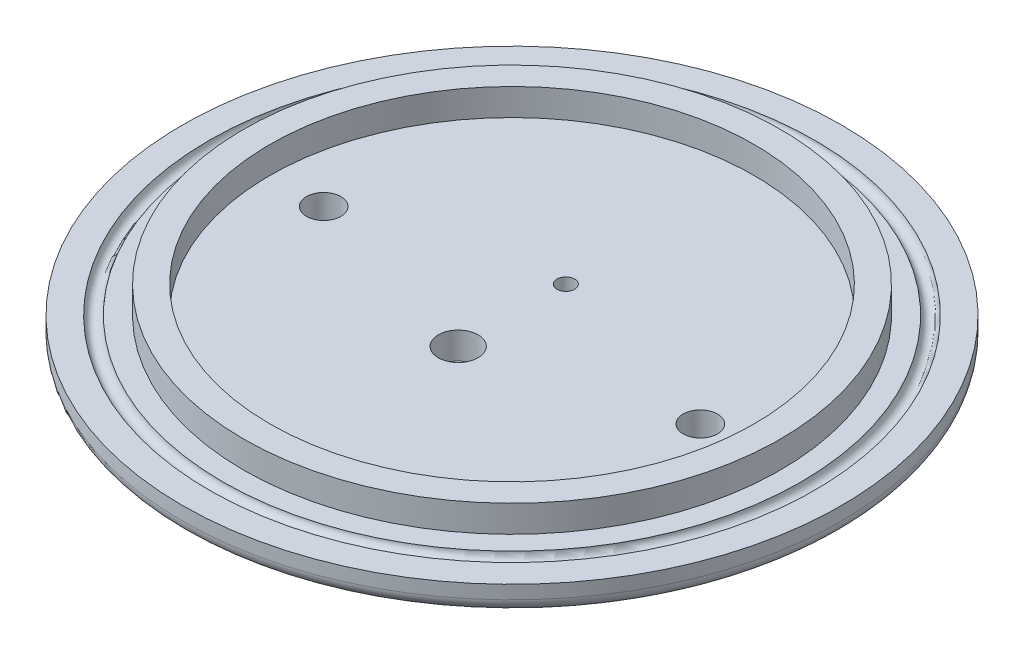
ISO-10303-21;
HEADER;
FILE_DESCRIPTION(('STEP AP214'),'2;1');
FILE_NAME('part.step','',(''),(''),'','','');
FILE_SCHEMA(('AUTOMOTIVE_DESIGN { 1 0 10303 214 1 1 1 1 }'));
ENDSEC;
DATA;
#1=APPLICATION_CONTEXT('core data for automotive mechanical design processes');
#2=APPLICATION_PROTOCOL_DEFINITION('international standard','automotive_design',2000,#1);
#3=PRODUCT_CONTEXT('',#1,'mechanical');
#4=PRODUCT('Part','Part','',(#3));
#5=PRODUCT_RELATED_PRODUCT_CATEGORY('part','',(#4));
#6=PRODUCT_DEFINITION_FORMATION('','',#4);
#7=PRODUCT_DEFINITION_CONTEXT('part definition',#1,'design');
#8=PRODUCT_DEFINITION('design','',#6,#7);
#9=PRODUCT_DEFINITION_SHAPE('','',#8);
#10=(LENGTH_UNIT() NAMED_UNIT(*) SI_UNIT(.MILLI.,.METRE.));
#11=(NAMED_UNIT(*) PLANE_ANGLE_UNIT() SI_UNIT($,.RADIAN.));
#12=(NAMED_UNIT(*) SI_UNIT($,.STERADIAN.) SOLID_ANGLE_UNIT());
#13=UNCERTAINTY_MEASURE_WITH_UNIT(LENGTH_MEASURE(1.E-05),#10,'distance_accuracy_value','');
#14=(GEOMETRIC_REPRESENTATION_CONTEXT(3) GLOBAL_UNCERTAINTY_ASSIGNED_CONTEXT((#13)) GLOBAL_UNIT_ASSIGNED_CONTEXT((#10,
#11,#12)) REPRESENTATION_CONTEXT('',''));
#15=CARTESIAN_POINT('',(0.,0.,0.));
#16=DIRECTION('',(0.,0.,1.));
#17=DIRECTION('',(1.,0.,0.));
#18=AXIS2_PLACEMENT_3D('',#15,#16,#17);
#19=CARTESIAN_POINT('',(0.,10.,0.));
#20=DIRECTION('',(0.,1.,0.));
#21=DIRECTION('',(0.,0.,1.));
#22=AXIS2_PLACEMENT_3D('',#19,#20,#21);
#23=PLANE('',#22);
#24=CARTESIAN_POINT('',(0.,10.,0.));
#25=DIRECTION('',(0.,1.,0.));
#26=DIRECTION('',(0.,0.,1.));
#27=AXIS2_PLACEMENT_3D('',#24,#25,#26);
#28=CIRCLE('',#27,122.5);
#29=CARTESIAN_POINT('',(0.,10.,122.5));
#30=VERTEX_POINT('',#29);
#31=EDGE_CURVE('E1578',#30,#30,#28,.T.);
#32=ORIENTED_EDGE('',*,*,#31,.T.);
#33=EDGE_LOOP('',(#32));
#34=FACE_BOUND('',#33,.T.);
#35=CARTESIAN_POINT('',(0.,10.,0.));
#36=DIRECTION('',(0.,1.,0.));
#37=DIRECTION('',(0.,0.,1.));
#38=AXIS2_PLACEMENT_3D('',#35,#36,#37);
#39=CIRCLE('',#38,112.6);
#40=CARTESIAN_POINT('',(-112.6,10.,0.));
#41=VERTEX_POINT('',#40);
#42=EDGE_CURVE('E1579',#41,#41,#39,.T.);
#43=ORIENTED_EDGE('',*,*,#42,.F.);
#44=EDGE_LOOP('',(#43));
#45=FACE_BOUND('',#44,.T.);
#46=ADVANCED_FACE('F1553',(#34,#45),#23,.T.);
#47=CARTESIAN_POINT('',(0.,10.,0.));
#48=DIRECTION('',(0.,-1.,0.));
#49=DIRECTION('',(0.,0.,-1.));
#50=AXIS2_PLACEMENT_3D('',#47,#48,#49);
#51=CYLINDRICAL_SURFACE('',#50,122.5);
#52=CARTESIAN_POINT('',(0.,5.,0.));
#53=DIRECTION('',(0.,1.,0.));
#54=DIRECTION('',(0.,0.,1.));
#55=AXIS2_PLACEMENT_3D('',#52,#53,#54);
#56=CIRCLE('',#55,122.5);
#57=CARTESIAN_POINT('',(0.,5.,122.5));
#58=VERTEX_POINT('',#57);
#59=EDGE_CURVE('E1563',#58,#58,#56,.T.);
#60=ORIENTED_EDGE('',*,*,#59,.T.);
#61=EDGE_LOOP('',(#60));
#62=FACE_BOUND('',#61,.T.);
#63=ORIENTED_EDGE('',*,*,#31,.F.);
#64=EDGE_LOOP('',(#63));
#65=FACE_BOUND('',#64,.T.);
#66=ADVANCED_FACE('F1651',(#62,#65),#51,.T.);
#67=CARTESIAN_POINT('',(0.,0.,0.));
#68=DIRECTION('',(0.,1.,0.));
#69=DIRECTION('',(0.,0.,1.));
#70=AXIS2_PLACEMENT_3D('',#67,#68,#69);
#71=PLANE('',#70);
#72=CARTESIAN_POINT('',(-70.,0.,0.));
#73=DIRECTION('',(0.,-1.,0.));
#74=DIRECTION('',(0.,0.,-1.));
#75=AXIS2_PLACEMENT_3D('',#72,#73,#74);
#76=CIRCLE('',#75,6.40000000000001);
#77=CARTESIAN_POINT('',(-70.,0.,-6.40000000000002));
#78=VERTEX_POINT('',#77);
#79=EDGE_CURVE('E1607',#78,#78,#76,.T.);
#80=ORIENTED_EDGE('',*,*,#79,.F.);
#81=EDGE_LOOP('',(#80));
#82=FACE_BOUND('',#81,.T.);
#83=CARTESIAN_POINT('',(0.,0.,20.));
#84=DIRECTION('',(0.,-1.,0.));
#85=DIRECTION('',(0.,0.,-1.));
#86=AXIS2_PLACEMENT_3D('',#83,#84,#85);
#87=CIRCLE('',#86,7.4);
#88=CARTESIAN_POINT('',(0.,0.,12.6));
#89=VERTEX_POINT('',#88);
#90=EDGE_CURVE('E1642',#89,#89,#87,.T.);
#91=ORIENTED_EDGE('',*,*,#90,.F.);
#92=EDGE_LOOP('',(#91));
#93=FACE_BOUND('',#92,.T.);
#94=CARTESIAN_POINT('',(0.,0.,-20.));
#95=DIRECTION('',(0.,-1.,0.));
#96=DIRECTION('',(0.,0.,-1.));
#97=AXIS2_PLACEMENT_3D('',#94,#95,#96);
#98=CIRCLE('',#97,3.3);
#99=CARTESIAN_POINT('',(0.,0.,-23.3));
#100=VERTEX_POINT('',#99);
#101=EDGE_CURVE('E1640',#100,#100,#98,.T.);
#102=ORIENTED_EDGE('',*,*,#101,.F.);
#103=EDGE_LOOP('',(#102));
#104=FACE_BOUND('',#103,.T.);
#105=CARTESIAN_POINT('',(70.,0.,0.));
#106=DIRECTION('',(0.,-1.,0.));
#107=DIRECTION('',(0.,0.,-1.));
#108=AXIS2_PLACEMENT_3D('',#105,#106,#107);
#109=CIRCLE('',#108,6.40000000000001);
#110=CARTESIAN_POINT('',(70.,0.,-6.40000000000001));
#111=VERTEX_POINT('',#110);
#112=EDGE_CURVE('E1633',#111,#111,#109,.T.);
#113=ORIENTED_EDGE('',*,*,#112,.F.);
#114=EDGE_LOOP('',(#113));
#115=FACE_BOUND('',#114,.T.);
#116=CARTESIAN_POINT('',(0.,0.,0.));
#117=DIRECTION('',(0.,1.,0.));
#118=DIRECTION('',(0.,0.,1.));
#119=AXIS2_PLACEMENT_3D('',#116,#117,#118);
#120=CIRCLE('',#119,117.5);
#121=CARTESIAN_POINT('',(0.,0.,117.5));
#122=VERTEX_POINT('',#121);
#123=EDGE_CURVE('E12',#122,#122,#120,.F.);
#124=ORIENTED_EDGE('',*,*,#123,.T.);
#125=EDGE_LOOP('',(#124));
#126=FACE_BOUND('',#125,.T.);
#127=ADVANCED_FACE('F1655',(#82,#93,#104,#115,#126),#71,.F.);
#128=CARTESIAN_POINT('',(0.,10.,0.));
#129=DIRECTION('',(0.,1.,0.));
#130=DIRECTION('',(0.,0.,1.));
#131=AXIS2_PLACEMENT_3D('',#128,#129,#130);
#132=TOROIDAL_SURFACE('',#131,110.,2.6);
#133=ORIENTED_EDGE('',*,*,#42,.T.);
#134=CARTESIAN_POINT('',(-110.,10.,0.));
#135=DIRECTION('',(0.,0.,1.));
#136=DIRECTION('',(1.,0.,0.));
#137=AXIS2_PLACEMENT_3D('',#134,#135,#136);
#138=CIRCLE('',#137,2.6);
#139=CARTESIAN_POINT('',(-107.4,10.,0.));
#140=VERTEX_POINT('',#139);
#141=EDGE_CURVE('E1571',#41,#140,#138,.T.);
#142=ORIENTED_EDGE('',*,*,#141,.T.);
#143=CARTESIAN_POINT('',(0.,10.,0.));
#144=DIRECTION('',(0.,-1.,0.));
#145=DIRECTION('',(0.,0.,-1.));
#146=AXIS2_PLACEMENT_3D('',#143,#144,#145);
#147=CIRCLE('',#146,107.4);
#148=EDGE_CURVE('E1577',#140,#140,#147,.T.);
#149=ORIENTED_EDGE('',*,*,#148,.T.);
#150=ORIENTED_EDGE('',*,*,#141,.F.);
#151=EDGE_LOOP('',(#133,#142,#149,#150));
#152=FACE_BOUND('',#151,.T.);
#153=ADVANCED_FACE('F1574',(#152),#132,.F.);
#154=CARTESIAN_POINT('',(0.,10.,0.));
#155=DIRECTION('',(0.,1.,0.));
#156=DIRECTION('',(0.,0.,1.));
#157=AXIS2_PLACEMENT_3D('',#154,#155,#156);
#158=CIRCLE('',#157,99.75);
#159=CARTESIAN_POINT('',(0.,10.,99.75));
#160=VERTEX_POINT('',#159);
#161=EDGE_CURVE('E1589',#160,#160,#158,.T.);
#162=ORIENTED_EDGE('',*,*,#161,.F.);
#163=EDGE_LOOP('',(#162));
#164=FACE_BOUND('',#163,.T.);
#165=ORIENTED_EDGE('',*,*,#148,.F.);
#166=EDGE_LOOP('',(#165));
#167=FACE_BOUND('',#166,.T.);
#168=ADVANCED_FACE('F1677',(#164,#167),#23,.T.);
#169=CARTESIAN_POINT('',(0.,20.,0.));
#170=DIRECTION('',(0.,1.,0.));
#171=DIRECTION('',(0.,0.,1.));
#172=AXIS2_PLACEMENT_3D('',#169,#170,#171);
#173=PLANE('',#172);
#174=CARTESIAN_POINT('',(0.,20.,0.));
#175=DIRECTION('',(0.,1.,0.));
#176=DIRECTION('',(0.,0.,1.));
#177=AXIS2_PLACEMENT_3D('',#174,#175,#176);
#178=CIRCLE('',#177,99.75);
#179=CARTESIAN_POINT('',(0.,20.,99.75));
#180=VERTEX_POINT('',#179);
#181=EDGE_CURVE('E1582',#180,#180,#178,.T.);
#182=ORIENTED_EDGE('',*,*,#181,.T.);
#183=EDGE_LOOP('',(#182));
#184=FACE_BOUND('',#183,.T.);
#185=CARTESIAN_POINT('',(0.,20.,0.));
#186=DIRECTION('',(0.,1.,0.));
#187=DIRECTION('',(0.,0.,1.));
#188=AXIS2_PLACEMENT_3D('',#185,#186,#187);
#189=CIRCLE('',#188,90.);
#190=CARTESIAN_POINT('',(0.,20.,90.));
#191=VERTEX_POINT('',#190);
#192=EDGE_CURVE('E1618',#191,#191,#189,.T.);
#193=ORIENTED_EDGE('',*,*,#192,.F.);
#194=EDGE_LOOP('',(#193));
#195=FACE_BOUND('',#194,.T.);
#196=ADVANCED_FACE('F1690',(#184,#195),#173,.T.);
#197=CARTESIAN_POINT('',(0.,20.,0.));
#198=DIRECTION('',(0.,-1.,0.));
#199=DIRECTION('',(0.,0.,-1.));
#200=AXIS2_PLACEMENT_3D('',#197,#198,#199);
#201=CYLINDRICAL_SURFACE('',#200,99.75);
#202=ORIENTED_EDGE('',*,*,#181,.F.);
#203=EDGE_LOOP('',(#202));
#204=FACE_BOUND('',#203,.T.);
#205=ORIENTED_EDGE('',*,*,#161,.T.);
#206=EDGE_LOOP('',(#205));
#207=FACE_BOUND('',#206,.T.);
#208=ADVANCED_FACE('F1694',(#204,#207),#201,.T.);
#209=CARTESIAN_POINT('',(0.,20.,0.));
#210=DIRECTION('',(0.,-1.,0.));
#211=DIRECTION('',(0.,0.,-1.));
#212=AXIS2_PLACEMENT_3D('',#209,#210,#211);
#213=CYLINDRICAL_SURFACE('',#212,90.);
#214=ORIENTED_EDGE('',*,*,#192,.T.);
#215=EDGE_LOOP('',(#214));
#216=FACE_BOUND('',#215,.T.);
#217=CARTESIAN_POINT('',(0.,10.,0.));
#218=DIRECTION('',(0.,1.,0.));
#219=DIRECTION('',(0.,0.,1.));
#220=AXIS2_PLACEMENT_3D('',#217,#218,#219);
#221=CIRCLE('',#220,90.);
#222=CARTESIAN_POINT('',(0.,10.,90.));
#223=VERTEX_POINT('',#222);
#224=EDGE_CURVE('E1600',#223,#223,#221,.F.);
#225=ORIENTED_EDGE('',*,*,#224,.T.);
#226=EDGE_LOOP('',(#225));
#227=FACE_BOUND('',#226,.T.);
#228=ADVANCED_FACE('F1681',(#216,#227),#213,.F.);
#229=CARTESIAN_POINT('',(-70.,10.,0.));
#230=DIRECTION('',(0.,1.,0.));
#231=DIRECTION('',(0.,0.,1.));
#232=AXIS2_PLACEMENT_3D('',#229,#230,#231);
#233=CIRCLE('',#232,6.40000000000001);
#234=CARTESIAN_POINT('',(-70.,10.,6.4));
#235=VERTEX_POINT('',#234);
#236=EDGE_CURVE('E1556',#235,#235,#233,.T.);
#237=ORIENTED_EDGE('',*,*,#236,.F.);
#238=EDGE_LOOP('',(#237));
#239=FACE_BOUND('',#238,.T.);
#240=CARTESIAN_POINT('',(0.,10.,20.));
#241=DIRECTION('',(0.,1.,0.));
#242=DIRECTION('',(0.,0.,1.));
#243=AXIS2_PLACEMENT_3D('',#240,#241,#242);
#244=CIRCLE('',#243,7.4);
#245=CARTESIAN_POINT('',(0.,10.,27.4));
#246=VERTEX_POINT('',#245);
#247=EDGE_CURVE('E1615',#246,#246,#244,.T.);
#248=ORIENTED_EDGE('',*,*,#247,.F.);
#249=EDGE_LOOP('',(#248));
#250=FACE_BOUND('',#249,.T.);
#251=CARTESIAN_POINT('',(0.,10.,-20.));
#252=DIRECTION('',(0.,1.,0.));
#253=DIRECTION('',(0.,0.,1.));
#254=AXIS2_PLACEMENT_3D('',#251,#252,#253);
#255=CIRCLE('',#254,3.3);
#256=CARTESIAN_POINT('',(0.,10.,-16.7));
#257=VERTEX_POINT('',#256);
#258=EDGE_CURVE('E1608',#257,#257,#255,.T.);
#259=ORIENTED_EDGE('',*,*,#258,.F.);
#260=EDGE_LOOP('',(#259));
#261=FACE_BOUND('',#260,.T.);
#262=CARTESIAN_POINT('',(70.,10.,0.));
#263=DIRECTION('',(0.,1.,0.));
#264=DIRECTION('',(0.,0.,1.));
#265=AXIS2_PLACEMENT_3D('',#262,#263,#264);
#266=CIRCLE('',#265,6.40000000000001);
#267=CARTESIAN_POINT('',(70.,10.,6.40000000000001));
#268=VERTEX_POINT('',#267);
#269=EDGE_CURVE('E1602',#268,#268,#266,.T.);
#270=ORIENTED_EDGE('',*,*,#269,.F.);
#271=EDGE_LOOP('',(#270));
#272=FACE_BOUND('',#271,.T.);
#273=ORIENTED_EDGE('',*,*,#224,.F.);
#274=EDGE_LOOP('',(#273));
#275=FACE_BOUND('',#274,.T.);
#276=ADVANCED_FACE('F1668',(#239,#250,#261,#272,#275),#23,.T.);
#277=CARTESIAN_POINT('',(0.,5.,0.));
#278=DIRECTION('',(0.,1.,0.));
#279=DIRECTION('',(0.,0.,1.));
#280=AXIS2_PLACEMENT_3D('',#277,#278,#279);
#281=TOROIDAL_SURFACE('',#280,117.5,5.);
#282=ORIENTED_EDGE('',*,*,#123,.F.);
#283=EDGE_LOOP('',(#282));
#284=FACE_BOUND('',#283,.T.);
#285=ORIENTED_EDGE('',*,*,#59,.F.);
#286=EDGE_LOOP('',(#285));
#287=FACE_BOUND('',#286,.T.);
#288=ADVANCED_FACE('F1560',(#284,#287),#281,.T.);
#289=CARTESIAN_POINT('',(70.,20.,0.));
#290=DIRECTION('',(0.,-1.,0.));
#291=DIRECTION('',(0.,0.,-1.));
#292=AXIS2_PLACEMENT_3D('',#289,#290,#291);
#293=CYLINDRICAL_SURFACE('',#292,6.40000000000001);
#294=ORIENTED_EDGE('',*,*,#269,.T.);
#295=EDGE_LOOP('',(#294));
#296=FACE_BOUND('',#295,.T.);
#297=ORIENTED_EDGE('',*,*,#112,.T.);
#298=EDGE_LOOP('',(#297));
#299=FACE_BOUND('',#298,.T.);
#300=ADVANCED_FACE('F1670',(#296,#299),#293,.F.);
#301=CARTESIAN_POINT('',(0.,20.,-20.));
#302=DIRECTION('',(0.,-1.,0.));
#303=DIRECTION('',(0.,0.,-1.));
#304=AXIS2_PLACEMENT_3D('',#301,#302,#303);
#305=CYLINDRICAL_SURFACE('',#304,3.3);
#306=ORIENTED_EDGE('',*,*,#258,.T.);
#307=EDGE_LOOP('',(#306));
#308=FACE_BOUND('',#307,.T.);
#309=ORIENTED_EDGE('',*,*,#101,.T.);
#310=EDGE_LOOP('',(#309));
#311=FACE_BOUND('',#310,.T.);
#312=ADVANCED_FACE('F1706',(#308,#311),#305,.F.);
#313=CARTESIAN_POINT('',(0.,20.,20.));
#314=DIRECTION('',(0.,-1.,0.));
#315=DIRECTION('',(0.,0.,-1.));
#316=AXIS2_PLACEMENT_3D('',#313,#314,#315);
#317=CYLINDRICAL_SURFACE('',#316,7.4);
#318=ORIENTED_EDGE('',*,*,#247,.T.);
#319=EDGE_LOOP('',(#318));
#320=FACE_BOUND('',#319,.T.);
#321=ORIENTED_EDGE('',*,*,#90,.T.);
#322=EDGE_LOOP('',(#321));
#323=FACE_BOUND('',#322,.T.);
#324=ADVANCED_FACE('F1715',(#320,#323),#317,.F.);
#325=CARTESIAN_POINT('',(-70.,20.,0.));
#326=DIRECTION('',(0.,-1.,0.));
#327=DIRECTION('',(0.,0.,-1.));
#328=AXIS2_PLACEMENT_3D('',#325,#326,#327);
#329=CYLINDRICAL_SURFACE('',#328,6.40000000000001);
#330=ORIENTED_EDGE('',*,*,#236,.T.);
#331=EDGE_LOOP('',(#330));
#332=FACE_BOUND('',#331,.T.);
#333=ORIENTED_EDGE('',*,*,#79,.T.);
#334=EDGE_LOOP('',(#333));
#335=FACE_BOUND('',#334,.T.);
#336=ADVANCED_FACE('F1648',(#332,#335),#329,.F.);
#337=CLOSED_SHELL('',(#46,#66,#127,#153,#168,#196,#208,#228,#276,#288,#300,#312,#324,#336));
#338=MANIFOLD_SOLID_BREP('B2',#337);
#339=ADVANCED_BREP_SHAPE_REPRESENTATION('',(#18,#338),#14);
#340=SHAPE_DEFINITION_REPRESENTATION(#9,#339);
ENDSEC;
END-ISO-10303-21;
